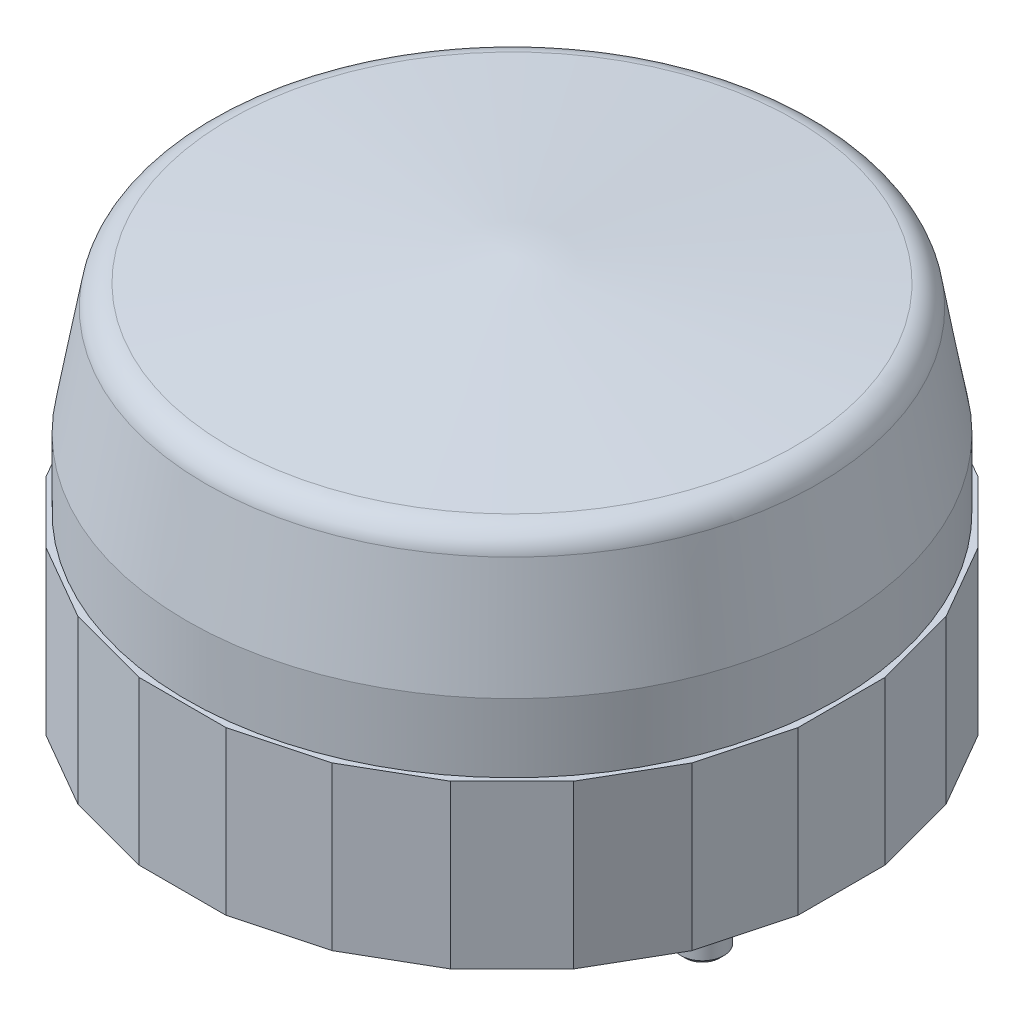
ISO-10303-21;
HEADER;
FILE_DESCRIPTION(('STEP AP214'),'2;1');
FILE_NAME('part.step','',(''),(''),'','','');
FILE_SCHEMA(('AUTOMOTIVE_DESIGN { 1 0 10303 214 1 1 1 1 }'));
ENDSEC;
DATA;
#1=APPLICATION_CONTEXT('core data for automotive mechanical design processes');
#2=APPLICATION_PROTOCOL_DEFINITION('international standard','automotive_design',2000,#1);
#3=PRODUCT_CONTEXT('',#1,'mechanical');
#4=PRODUCT('Part','Part','',(#3));
#5=PRODUCT_RELATED_PRODUCT_CATEGORY('part','',(#4));
#6=PRODUCT_DEFINITION_FORMATION('','',#4);
#7=PRODUCT_DEFINITION_CONTEXT('part definition',#1,'design');
#8=PRODUCT_DEFINITION('design','',#6,#7);
#9=PRODUCT_DEFINITION_SHAPE('','',#8);
#10=(LENGTH_UNIT() NAMED_UNIT(*) SI_UNIT(.MILLI.,.METRE.));
#11=(NAMED_UNIT(*) PLANE_ANGLE_UNIT() SI_UNIT($,.RADIAN.));
#12=(NAMED_UNIT(*) SI_UNIT($,.STERADIAN.) SOLID_ANGLE_UNIT());
#13=UNCERTAINTY_MEASURE_WITH_UNIT(LENGTH_MEASURE(1.E-05),#10,'distance_accuracy_value','');
#14=(GEOMETRIC_REPRESENTATION_CONTEXT(3) GLOBAL_UNCERTAINTY_ASSIGNED_CONTEXT((#13)) GLOBAL_UNIT_ASSIGNED_CONTEXT((#10,
#11,#12)) REPRESENTATION_CONTEXT('',''));
#15=CARTESIAN_POINT('',(0.,0.,0.));
#16=DIRECTION('',(0.,0.,1.));
#17=DIRECTION('',(1.,0.,0.));
#18=AXIS2_PLACEMENT_3D('',#15,#16,#17);
#19=CARTESIAN_POINT('',(22.25,-13.75,0.));
#20=DIRECTION('',(0.,1.,0.));
#21=DIRECTION('',(-1.,0.,0.));
#22=AXIS2_PLACEMENT_3D('',#19,#20,#21);
#23=CONICAL_SURFACE('',#22,2.25,0.785398162499998);
#24=CARTESIAN_POINT('',(22.25,-13.5,0.));
#25=DIRECTION('',(0.,-1.,0.));
#26=DIRECTION('',(-1.,0.,0.));
#27=AXIS2_PLACEMENT_3D('',#24,#25,#26);
#28=CIRCLE('',#27,2.5);
#29=CARTESIAN_POINT('',(24.75,-13.5,0.));
#30=VERTEX_POINT('',#29);
#31=EDGE_CURVE('E11',#30,#30,#28,.T.);
#32=ORIENTED_EDGE('',*,*,#31,.T.);
#33=EDGE_LOOP('',(#32));
#34=FACE_BOUND('',#33,.T.);
#35=CARTESIAN_POINT('',(22.25,-14.,0.));
#36=DIRECTION('',(0.,1.,0.));
#37=DIRECTION('',(-1.,0.,0.));
#38=AXIS2_PLACEMENT_3D('',#35,#36,#37);
#39=CIRCLE('',#38,2.);
#40=CARTESIAN_POINT('',(24.25,-14.,0.));
#41=VERTEX_POINT('',#40);
#42=EDGE_CURVE('E26',#41,#41,#39,.T.);
#43=ORIENTED_EDGE('',*,*,#42,.T.);
#44=EDGE_LOOP('',(#43));
#45=FACE_BOUND('',#44,.T.);
#46=ADVANCED_FACE('F16',(#34,#45),#23,.T.);
#47=CARTESIAN_POINT('',(22.25,0.,0.));
#48=DIRECTION('',(0.,-1.,0.));
#49=DIRECTION('',(-1.,0.,0.));
#50=AXIS2_PLACEMENT_3D('',#47,#48,#49);
#51=CYLINDRICAL_SURFACE('',#50,2.5);
#52=CARTESIAN_POINT('',(22.25,0.,0.));
#53=DIRECTION('',(0.,1.,0.));
#54=DIRECTION('',(-1.,0.,0.));
#55=AXIS2_PLACEMENT_3D('',#52,#53,#54);
#56=CIRCLE('',#55,2.5);
#57=CARTESIAN_POINT('',(24.75,0.,0.));
#58=VERTEX_POINT('',#57);
#59=EDGE_CURVE('E558',#58,#58,#56,.T.);
#60=ORIENTED_EDGE('',*,*,#59,.F.);
#61=EDGE_LOOP('',(#60));
#62=FACE_BOUND('',#61,.T.);
#63=ORIENTED_EDGE('',*,*,#31,.F.);
#64=EDGE_LOOP('',(#63));
#65=FACE_BOUND('',#64,.T.);
#66=ADVANCED_FACE('F802',(#62,#65),#51,.T.);
#67=CARTESIAN_POINT('',(22.25,-14.,0.));
#68=DIRECTION('',(0.,1.,0.));
#69=DIRECTION('',(1.,0.,0.));
#70=AXIS2_PLACEMENT_3D('',#67,#68,#69);
#71=PLANE('',#70);
#72=ORIENTED_EDGE('',*,*,#42,.F.);
#73=EDGE_LOOP('',(#72));
#74=FACE_BOUND('',#73,.T.);
#75=ADVANCED_FACE('F808',(#74),#71,.F.);
#76=CARTESIAN_POINT('',(-22.25,-13.75,0.));
#77=DIRECTION('',(0.,1.,0.));
#78=DIRECTION('',(-1.,0.,0.));
#79=AXIS2_PLACEMENT_3D('',#76,#77,#78);
#80=CONICAL_SURFACE('',#79,2.25,0.785398162499998);
#81=CARTESIAN_POINT('',(-22.25,-13.5,0.));
#82=DIRECTION('',(0.,-1.,0.));
#83=DIRECTION('',(-1.,0.,0.));
#84=AXIS2_PLACEMENT_3D('',#81,#82,#83);
#85=CIRCLE('',#84,2.5);
#86=CARTESIAN_POINT('',(-19.75,-13.5,0.));
#87=VERTEX_POINT('',#86);
#88=EDGE_CURVE('E317',#87,#87,#85,.T.);
#89=ORIENTED_EDGE('',*,*,#88,.T.);
#90=EDGE_LOOP('',(#89));
#91=FACE_BOUND('',#90,.T.);
#92=CARTESIAN_POINT('',(-22.25,-14.,0.));
#93=DIRECTION('',(0.,1.,0.));
#94=DIRECTION('',(-1.,0.,0.));
#95=AXIS2_PLACEMENT_3D('',#92,#93,#94);
#96=CIRCLE('',#95,2.);
#97=CARTESIAN_POINT('',(-20.25,-14.,0.));
#98=VERTEX_POINT('',#97);
#99=EDGE_CURVE('E426',#98,#98,#96,.T.);
#100=ORIENTED_EDGE('',*,*,#99,.T.);
#101=EDGE_LOOP('',(#100));
#102=FACE_BOUND('',#101,.T.);
#103=ADVANCED_FACE('F930',(#91,#102),#80,.T.);
#104=CARTESIAN_POINT('',(-22.25,0.,0.));
#105=DIRECTION('',(0.,-1.,0.));
#106=DIRECTION('',(-1.,0.,0.));
#107=AXIS2_PLACEMENT_3D('',#104,#105,#106);
#108=CYLINDRICAL_SURFACE('',#107,2.5);
#109=CARTESIAN_POINT('',(-22.25,0.,0.));
#110=DIRECTION('',(0.,1.,0.));
#111=DIRECTION('',(-1.,0.,0.));
#112=AXIS2_PLACEMENT_3D('',#109,#110,#111);
#113=CIRCLE('',#112,2.5);
#114=CARTESIAN_POINT('',(-19.75,0.,0.));
#115=VERTEX_POINT('',#114);
#116=EDGE_CURVE('E436',#115,#115,#113,.T.);
#117=ORIENTED_EDGE('',*,*,#116,.F.);
#118=EDGE_LOOP('',(#117));
#119=FACE_BOUND('',#118,.T.);
#120=ORIENTED_EDGE('',*,*,#88,.F.);
#121=EDGE_LOOP('',(#120));
#122=FACE_BOUND('',#121,.T.);
#123=ADVANCED_FACE('F813',(#119,#122),#108,.T.);
#124=CARTESIAN_POINT('',(-22.25,-14.,0.));
#125=DIRECTION('',(0.,1.,0.));
#126=DIRECTION('',(1.,0.,0.));
#127=AXIS2_PLACEMENT_3D('',#124,#125,#126);
#128=PLANE('',#127);
#129=ORIENTED_EDGE('',*,*,#99,.F.);
#130=EDGE_LOOP('',(#129));
#131=FACE_BOUND('',#130,.T.);
#132=ADVANCED_FACE('F913',(#131),#128,.F.);
#133=CARTESIAN_POINT('',(0.,33.3634229025263,0.));
#134=DIRECTION('',(0.,-1.,0.));
#135=DIRECTION('',(0.,0.,1.));
#136=AXIS2_PLACEMENT_3D('',#133,#134,#135);
#137=CONICAL_SURFACE('',#136,36.8779568526265,0.174532925);
#138=CARTESIAN_POINT('',(0.,39.7268458050524,0.));
#139=DIRECTION('',(0.,1.,0.));
#140=DIRECTION('',(0.,0.,1.));
#141=AXIS2_PLACEMENT_3D('',#138,#139,#140);
#142=CIRCLE('',#141,35.7559137052529);
#143=CARTESIAN_POINT('',(0.,39.7268458050524,35.7559137052529));
#144=VERTEX_POINT('',#143);
#145=EDGE_CURVE('E416',#144,#144,#142,.T.);
#146=ORIENTED_EDGE('',*,*,#145,.F.);
#147=EDGE_LOOP('',(#146));
#148=FACE_BOUND('',#147,.T.);
#149=CARTESIAN_POINT('',(0.,27.,0.));
#150=DIRECTION('',(0.,1.,0.));
#151=DIRECTION('',(-1.,0.,0.));
#152=AXIS2_PLACEMENT_3D('',#149,#150,#151);
#153=CIRCLE('',#152,38.);
#154=CARTESIAN_POINT('',(38.,27.,0.));
#155=VERTEX_POINT('',#154);
#156=EDGE_CURVE('E419',#155,#155,#153,.T.);
#157=ORIENTED_EDGE('',*,*,#156,.T.);
#158=EDGE_LOOP('',(#157));
#159=FACE_BOUND('',#158,.T.);
#160=ADVANCED_FACE('F905',(#148,#159),#137,.T.);
#161=CARTESIAN_POINT('',(0.,39.2059012720516,0.));
#162=DIRECTION('',(0.,1.,0.));
#163=DIRECTION('',(0.,0.,1.));
#164=AXIS2_PLACEMENT_3D('',#161,#162,#163);
#165=TOROIDAL_SURFACE('',#164,32.8014904462163,3.);
#166=CARTESIAN_POINT('',(0.,42.1951590969856,0.));
#167=DIRECTION('',(0.,1.,0.));
#168=DIRECTION('',(0.,0.,1.));
#169=AXIS2_PLACEMENT_3D('',#166,#167,#168);
#170=CIRCLE('',#169,33.0551391325344);
#171=CARTESIAN_POINT('',(0.,42.1951590969856,33.0551391325344));
#172=VERTEX_POINT('',#171);
#173=EDGE_CURVE('E373',#172,#172,#170,.T.);
#174=ORIENTED_EDGE('',*,*,#173,.F.);
#175=EDGE_LOOP('',(#174));
#176=FACE_BOUND('',#175,.T.);
#177=ORIENTED_EDGE('',*,*,#145,.T.);
#178=EDGE_LOOP('',(#177));
#179=FACE_BOUND('',#178,.T.);
#180=ADVANCED_FACE('F902',(#176,#179),#165,.T.);
#181=CARTESIAN_POINT('',(0.,43.5975795484928,0.));
#182=DIRECTION('',(0.,-1.,0.));
#183=DIRECTION('',(0.,0.,1.));
#184=AXIS2_PLACEMENT_3D('',#181,#182,#183);
#185=CONICAL_SURFACE('',#184,16.5275695662672,1.48614570198298);
#186=CARTESIAN_POINT('',(0.,45.0000000282687,0.));
#187=VERTEX_POINT('',#186);
#188=VERTEX_LOOP('',#187);
#189=FACE_BOUND('',#188,.T.);
#190=ORIENTED_EDGE('',*,*,#173,.T.);
#191=EDGE_LOOP('',(#190));
#192=FACE_BOUND('',#191,.T.);
#193=ADVANCED_FACE('F904',(#189,#192),#185,.T.);
#194=CARTESIAN_POINT('',(0.,19.,0.));
#195=DIRECTION('',(0.,1.,0.));
#196=DIRECTION('',(-1.,0.,0.));
#197=AXIS2_PLACEMENT_3D('',#194,#195,#196);
#198=CYLINDRICAL_SURFACE('',#197,38.);
#199=ORIENTED_EDGE('',*,*,#156,.F.);
#200=EDGE_LOOP('',(#199));
#201=FACE_BOUND('',#200,.T.);
#202=CARTESIAN_POINT('',(0.,19.,0.));
#203=DIRECTION('',(0.,-1.,0.));
#204=DIRECTION('',(-1.,0.,0.));
#205=AXIS2_PLACEMENT_3D('',#202,#203,#204);
#206=CIRCLE('',#205,38.);
#207=CARTESIAN_POINT('',(38.,19.,0.));
#208=VERTEX_POINT('',#207);
#209=EDGE_CURVE('E735',#208,#208,#206,.T.);
#210=ORIENTED_EDGE('',*,*,#209,.F.);
#211=EDGE_LOOP('',(#210));
#212=FACE_BOUND('',#211,.T.);
#213=ADVANCED_FACE('F911',(#201,#212),#198,.T.);
#214=CARTESIAN_POINT('',(-23.6395546842207,0.,-30.8076674671435));
#215=DIRECTION('',(-0.707106781186547,0.,-0.707106781186548));
#216=DIRECTION('',(-0.707106781186548,0.,0.707106781186547));
#217=AXIS2_PLACEMENT_3D('',#214,#215,#216);
#218=PLANE('',#217);
#219=DIRECTION('',(0.707106781186548,0.,-0.707106781186547));
#220=VECTOR('',#219,1.);
#221=CARTESIAN_POINT('',(-30.8076674671435,0.,-23.6395546842207));
#222=LINE('',#221,#220);
#223=CARTESIAN_POINT('',(-30.8076674671435,0.,-23.6395546842207));
#224=VERTEX_POINT('',#223);
#225=CARTESIAN_POINT('',(-23.6395546842207,0.,-30.8076674671435));
#226=VERTEX_POINT('',#225);
#227=EDGE_CURVE('E571',#224,#226,#222,.T.);
#228=ORIENTED_EDGE('',*,*,#227,.F.);
#229=DIRECTION('',(0.,1.,0.));
#230=VECTOR('',#229,1.);
#231=CARTESIAN_POINT('',(-30.8076674671435,0.,-23.6395546842207));
#232=LINE('',#231,#230);
#233=CARTESIAN_POINT('',(-30.8076674671435,19.,-23.6395546842207));
#234=VERTEX_POINT('',#233);
#235=EDGE_CURVE('E369',#224,#234,#232,.T.);
#236=ORIENTED_EDGE('',*,*,#235,.T.);
#237=DIRECTION('',(-0.707106781186548,0.,0.707106781186547));
#238=VECTOR('',#237,1.);
#239=CARTESIAN_POINT('',(-23.6395546842207,19.,-30.8076674671435));
#240=LINE('',#239,#238);
#241=CARTESIAN_POINT('',(-23.6395546842207,19.,-30.8076674671435));
#242=VERTEX_POINT('',#241);
#243=EDGE_CURVE('E413',#242,#234,#240,.T.);
#244=ORIENTED_EDGE('',*,*,#243,.F.);
#245=DIRECTION('',(0.,1.,0.));
#246=VECTOR('',#245,1.);
#247=CARTESIAN_POINT('',(-23.6395546842207,0.,-30.8076674671435));
#248=LINE('',#247,#246);
#249=EDGE_CURVE('E374',#226,#242,#248,.T.);
#250=ORIENTED_EDGE('',*,*,#249,.F.);
#251=EDGE_LOOP('',(#228,#236,#244,#250));
#252=FACE_BOUND('',#251,.T.);
#253=ADVANCED_FACE('F824',(#252),#218,.T.);
#254=CARTESIAN_POINT('',(-14.8604453157794,0.,-35.8762886242583));
#255=DIRECTION('',(-0.5,0.,-0.866025403784439));
#256=DIRECTION('',(-0.866025403784439,0.,0.5));
#257=AXIS2_PLACEMENT_3D('',#254,#255,#256);
#258=PLANE('',#257);
#259=DIRECTION('',(0.866025403784439,0.,-0.5));
#260=VECTOR('',#259,1.);
#261=CARTESIAN_POINT('',(-23.6395546842207,0.,-30.8076674671435));
#262=LINE('',#261,#260);
#263=CARTESIAN_POINT('',(-14.8604453157794,0.,-35.8762886242583));
#264=VERTEX_POINT('',#263);
#265=EDGE_CURVE('E576',#226,#264,#262,.T.);
#266=ORIENTED_EDGE('',*,*,#265,.F.);
#267=ORIENTED_EDGE('',*,*,#249,.T.);
#268=DIRECTION('',(-0.866025403784439,0.,0.5));
#269=VECTOR('',#268,1.);
#270=CARTESIAN_POINT('',(-14.8604453157794,19.,-35.8762886242583));
#271=LINE('',#270,#269);
#272=CARTESIAN_POINT('',(-14.8604453157794,19.,-35.8762886242583));
#273=VERTEX_POINT('',#272);
#274=EDGE_CURVE('E408',#273,#242,#271,.T.);
#275=ORIENTED_EDGE('',*,*,#274,.F.);
#276=DIRECTION('',(0.,1.,0.));
#277=VECTOR('',#276,1.);
#278=CARTESIAN_POINT('',(-14.8604453157794,0.,-35.8762886242583));
#279=LINE('',#278,#277);
#280=EDGE_CURVE('E710',#264,#273,#279,.T.);
#281=ORIENTED_EDGE('',*,*,#280,.F.);
#282=EDGE_LOOP('',(#266,#267,#275,#281));
#283=FACE_BOUND('',#282,.T.);
#284=ADVANCED_FACE('F817',(#283),#258,.T.);
#285=CARTESIAN_POINT('',(-5.06862115711474,0.,-38.5));
#286=DIRECTION('',(-0.258819045102519,0.,-0.965925826289069));
#287=DIRECTION('',(-0.965925826289069,0.,0.258819045102519));
#288=AXIS2_PLACEMENT_3D('',#285,#286,#287);
#289=PLANE('',#288);
#290=DIRECTION('',(0.965925826289069,0.,-0.258819045102519));
#291=VECTOR('',#290,1.);
#292=CARTESIAN_POINT('',(-14.8604453157794,0.,-35.8762886242583));
#293=LINE('',#292,#291);
#294=CARTESIAN_POINT('',(-5.06862115711473,0.,-38.5));
#295=VERTEX_POINT('',#294);
#296=EDGE_CURVE('E281',#264,#295,#293,.T.);
#297=ORIENTED_EDGE('',*,*,#296,.F.);
#298=ORIENTED_EDGE('',*,*,#280,.T.);
#299=DIRECTION('',(-0.965925826289069,0.,0.258819045102519));
#300=VECTOR('',#299,1.);
#301=CARTESIAN_POINT('',(-5.06862115711474,19.,-38.5));
#302=LINE('',#301,#300);
#303=CARTESIAN_POINT('',(-5.06862115711474,19.,-38.5));
#304=VERTEX_POINT('',#303);
#305=EDGE_CURVE('E412',#304,#273,#302,.T.);
#306=ORIENTED_EDGE('',*,*,#305,.F.);
#307=DIRECTION('',(0.,1.,0.));
#308=VECTOR('',#307,1.);
#309=CARTESIAN_POINT('',(-5.06862115711473,0.,-38.5));
#310=LINE('',#309,#308);
#311=EDGE_CURVE('E295',#295,#304,#310,.T.);
#312=ORIENTED_EDGE('',*,*,#311,.F.);
#313=EDGE_LOOP('',(#297,#298,#306,#312));
#314=FACE_BOUND('',#313,.T.);
#315=ADVANCED_FACE('F815',(#314),#289,.T.);
#316=CARTESIAN_POINT('',(5.06862115711475,0.,-38.5));
#317=DIRECTION('',(0.,0.,-1.));
#318=DIRECTION('',(0.,-1.,0.));
#319=AXIS2_PLACEMENT_3D('',#316,#317,#318);
#320=PLANE('',#319);
#321=DIRECTION('',(1.,0.,0.));
#322=VECTOR('',#321,1.);
#323=CARTESIAN_POINT('',(-5.06862115711473,0.,-38.5));
#324=LINE('',#323,#322);
#325=CARTESIAN_POINT('',(5.06862115711475,0.,-38.5));
#326=VERTEX_POINT('',#325);
#327=EDGE_CURVE('E272',#295,#326,#324,.T.);
#328=ORIENTED_EDGE('',*,*,#327,.F.);
#329=ORIENTED_EDGE('',*,*,#311,.T.);
#330=DIRECTION('',(-1.,0.,0.));
#331=VECTOR('',#330,1.);
#332=CARTESIAN_POINT('',(5.06862115711475,19.,-38.5));
#333=LINE('',#332,#331);
#334=CARTESIAN_POINT('',(5.06862115711475,19.,-38.5));
#335=VERTEX_POINT('',#334);
#336=EDGE_CURVE('E291',#335,#304,#333,.T.);
#337=ORIENTED_EDGE('',*,*,#336,.F.);
#338=DIRECTION('',(0.,1.,0.));
#339=VECTOR('',#338,1.);
#340=CARTESIAN_POINT('',(5.06862115711475,0.,-38.5));
#341=LINE('',#340,#339);
#342=EDGE_CURVE('E288',#326,#335,#341,.T.);
#343=ORIENTED_EDGE('',*,*,#342,.F.);
#344=EDGE_LOOP('',(#328,#329,#337,#343));
#345=FACE_BOUND('',#344,.T.);
#346=ADVANCED_FACE('F289',(#345),#320,.T.);
#347=CARTESIAN_POINT('',(14.8604453157794,0.,-35.8762886242583));
#348=DIRECTION('',(0.258819045102521,0.,-0.965925826289068));
#349=DIRECTION('',(0.,-1.,0.));
#350=AXIS2_PLACEMENT_3D('',#347,#348,#349);
#351=PLANE('',#350);
#352=DIRECTION('',(0.965925826289068,0.,0.258819045102521));
#353=VECTOR('',#352,1.);
#354=CARTESIAN_POINT('',(5.06862115711475,0.,-38.5));
#355=LINE('',#354,#353);
#356=CARTESIAN_POINT('',(14.8604453157794,0.,-35.8762886242583));
#357=VERTEX_POINT('',#356);
#358=EDGE_CURVE('E278',#326,#357,#355,.T.);
#359=ORIENTED_EDGE('',*,*,#358,.F.);
#360=ORIENTED_EDGE('',*,*,#342,.T.);
#361=DIRECTION('',(-0.965925826289068,0.,-0.258819045102521));
#362=VECTOR('',#361,1.);
#363=CARTESIAN_POINT('',(14.8604453157794,19.,-35.8762886242583));
#364=LINE('',#363,#362);
#365=CARTESIAN_POINT('',(14.8604453157794,19.,-35.8762886242583));
#366=VERTEX_POINT('',#365);
#367=EDGE_CURVE('E415',#366,#335,#364,.T.);
#368=ORIENTED_EDGE('',*,*,#367,.F.);
#369=DIRECTION('',(0.,1.,0.));
#370=VECTOR('',#369,1.);
#371=CARTESIAN_POINT('',(14.8604453157794,0.,-35.8762886242583));
#372=LINE('',#371,#370);
#373=EDGE_CURVE('E296',#357,#366,#372,.T.);
#374=ORIENTED_EDGE('',*,*,#373,.F.);
#375=EDGE_LOOP('',(#359,#360,#368,#374));
#376=FACE_BOUND('',#375,.T.);
#377=ADVANCED_FACE('F298',(#376),#351,.T.);
#378=CARTESIAN_POINT('',(23.6395546842207,0.,-30.8076674671435));
#379=DIRECTION('',(0.5,0.,-0.866025403784439));
#380=DIRECTION('',(0.,-1.,0.));
#381=AXIS2_PLACEMENT_3D('',#378,#379,#380);
#382=PLANE('',#381);
#383=DIRECTION('',(0.866025403784439,0.,0.5));
#384=VECTOR('',#383,1.);
#385=CARTESIAN_POINT('',(14.8604453157794,0.,-35.8762886242583));
#386=LINE('',#385,#384);
#387=CARTESIAN_POINT('',(23.6395546842207,0.,-30.8076674671435));
#388=VERTEX_POINT('',#387);
#389=EDGE_CURVE('E302',#357,#388,#386,.T.);
#390=ORIENTED_EDGE('',*,*,#389,.F.);
#391=ORIENTED_EDGE('',*,*,#373,.T.);
#392=DIRECTION('',(-0.866025403784439,0.,-0.5));
#393=VECTOR('',#392,1.);
#394=CARTESIAN_POINT('',(23.6395546842207,19.,-30.8076674671435));
#395=LINE('',#394,#393);
#396=CARTESIAN_POINT('',(23.6395546842207,19.,-30.8076674671435));
#397=VERTEX_POINT('',#396);
#398=EDGE_CURVE('E460',#397,#366,#395,.T.);
#399=ORIENTED_EDGE('',*,*,#398,.F.);
#400=DIRECTION('',(0.,1.,0.));
#401=VECTOR('',#400,1.);
#402=CARTESIAN_POINT('',(23.6395546842207,0.,-30.8076674671435));
#403=LINE('',#402,#401);
#404=EDGE_CURVE('E358',#388,#397,#403,.T.);
#405=ORIENTED_EDGE('',*,*,#404,.F.);
#406=EDGE_LOOP('',(#390,#391,#399,#405));
#407=FACE_BOUND('',#406,.T.);
#408=ADVANCED_FACE('F789',(#407),#382,.T.);
#409=CARTESIAN_POINT('',(30.8076674671435,0.,-23.6395546842207));
#410=DIRECTION('',(0.707106781186548,0.,-0.707106781186547));
#411=DIRECTION('',(0.,-1.,0.));
#412=AXIS2_PLACEMENT_3D('',#409,#410,#411);
#413=PLANE('',#412);
#414=DIRECTION('',(0.707106781186547,0.,0.707106781186548));
#415=VECTOR('',#414,1.);
#416=CARTESIAN_POINT('',(23.6395546842207,0.,-30.8076674671435));
#417=LINE('',#416,#415);
#418=CARTESIAN_POINT('',(30.8076674671435,0.,-23.6395546842207));
#419=VERTEX_POINT('',#418);
#420=EDGE_CURVE('E308',#388,#419,#417,.T.);
#421=ORIENTED_EDGE('',*,*,#420,.F.);
#422=ORIENTED_EDGE('',*,*,#404,.T.);
#423=DIRECTION('',(-0.707106781186547,0.,-0.707106781186548));
#424=VECTOR('',#423,1.);
#425=CARTESIAN_POINT('',(30.8076674671435,19.,-23.6395546842207));
#426=LINE('',#425,#424);
#427=CARTESIAN_POINT('',(30.8076674671435,19.,-23.6395546842207));
#428=VERTEX_POINT('',#427);
#429=EDGE_CURVE('E466',#428,#397,#426,.T.);
#430=ORIENTED_EDGE('',*,*,#429,.F.);
#431=DIRECTION('',(0.,1.,0.));
#432=VECTOR('',#431,1.);
#433=CARTESIAN_POINT('',(30.8076674671435,0.,-23.6395546842207));
#434=LINE('',#433,#432);
#435=EDGE_CURVE('E354',#419,#428,#434,.T.);
#436=ORIENTED_EDGE('',*,*,#435,.F.);
#437=EDGE_LOOP('',(#421,#422,#430,#436));
#438=FACE_BOUND('',#437,.T.);
#439=ADVANCED_FACE('F774',(#438),#413,.T.);
#440=CARTESIAN_POINT('',(35.8762886242583,0.,-14.8604453157793));
#441=DIRECTION('',(0.866025403784439,0.,-0.5));
#442=DIRECTION('',(0.,-1.,0.));
#443=AXIS2_PLACEMENT_3D('',#440,#441,#442);
#444=PLANE('',#443);
#445=DIRECTION('',(0.5,0.,0.866025403784439));
#446=VECTOR('',#445,1.);
#447=CARTESIAN_POINT('',(30.8076674671435,0.,-23.6395546842207));
#448=LINE('',#447,#446);
#449=CARTESIAN_POINT('',(35.8762886242583,0.,-14.8604453157793));
#450=VERTEX_POINT('',#449);
#451=EDGE_CURVE('E395',#419,#450,#448,.T.);
#452=ORIENTED_EDGE('',*,*,#451,.F.);
#453=ORIENTED_EDGE('',*,*,#435,.T.);
#454=DIRECTION('',(-0.5,0.,-0.866025403784439));
#455=VECTOR('',#454,1.);
#456=CARTESIAN_POINT('',(35.8762886242583,19.,-14.8604453157794));
#457=LINE('',#456,#455);
#458=CARTESIAN_POINT('',(35.8762886242583,19.,-14.8604453157793));
#459=VERTEX_POINT('',#458);
#460=EDGE_CURVE('E312',#459,#428,#457,.T.);
#461=ORIENTED_EDGE('',*,*,#460,.F.);
#462=DIRECTION('',(0.,1.,0.));
#463=VECTOR('',#462,1.);
#464=CARTESIAN_POINT('',(35.8762886242583,0.,-14.8604453157793));
#465=LINE('',#464,#463);
#466=EDGE_CURVE('E359',#450,#459,#465,.T.);
#467=ORIENTED_EDGE('',*,*,#466,.F.);
#468=EDGE_LOOP('',(#452,#453,#461,#467));
#469=FACE_BOUND('',#468,.T.);
#470=ADVANCED_FACE('F782',(#469),#444,.T.);
#471=CARTESIAN_POINT('',(38.5,0.,-5.06862115711473));
#472=DIRECTION('',(0.965925826289068,0.,-0.258819045102521));
#473=DIRECTION('',(0.,-1.,0.));
#474=AXIS2_PLACEMENT_3D('',#471,#472,#473);
#475=PLANE('',#474);
#476=DIRECTION('',(0.258819045102521,0.,0.965925826289068));
#477=VECTOR('',#476,1.);
#478=CARTESIAN_POINT('',(35.8762886242583,0.,-14.8604453157793));
#479=LINE('',#478,#477);
#480=CARTESIAN_POINT('',(38.5,0.,-5.06862115711473));
#481=VERTEX_POINT('',#480);
#482=EDGE_CURVE('E363',#450,#481,#479,.T.);
#483=ORIENTED_EDGE('',*,*,#482,.F.);
#484=ORIENTED_EDGE('',*,*,#466,.T.);
#485=DIRECTION('',(-0.258819045102521,0.,-0.965925826289068));
#486=VECTOR('',#485,1.);
#487=CARTESIAN_POINT('',(38.5,19.,-5.06862115711473));
#488=LINE('',#487,#486);
#489=CARTESIAN_POINT('',(38.5,19.,-5.06862115711473));
#490=VERTEX_POINT('',#489);
#491=EDGE_CURVE('E344',#490,#459,#488,.T.);
#492=ORIENTED_EDGE('',*,*,#491,.F.);
#493=DIRECTION('',(0.,1.,0.));
#494=VECTOR('',#493,1.);
#495=CARTESIAN_POINT('',(38.5,0.,-5.06862115711473));
#496=LINE('',#495,#494);
#497=EDGE_CURVE('E441',#481,#490,#496,.T.);
#498=ORIENTED_EDGE('',*,*,#497,.F.);
#499=EDGE_LOOP('',(#483,#484,#492,#498));
#500=FACE_BOUND('',#499,.T.);
#501=ADVANCED_FACE('F785',(#500),#475,.T.);
#502=CARTESIAN_POINT('',(38.5,0.,5.06862115711475));
#503=DIRECTION('',(1.,0.,0.));
#504=DIRECTION('',(0.,1.,0.));
#505=AXIS2_PLACEMENT_3D('',#502,#503,#504);
#506=PLANE('',#505);
#507=DIRECTION('',(0.,0.,1.));
#508=VECTOR('',#507,1.);
#509=CARTESIAN_POINT('',(38.5,0.,-5.06862115711473));
#510=LINE('',#509,#508);
#511=CARTESIAN_POINT('',(38.5,0.,5.06862115711475));
#512=VERTEX_POINT('',#511);
#513=EDGE_CURVE('E360',#481,#512,#510,.T.);
#514=ORIENTED_EDGE('',*,*,#513,.F.);
#515=ORIENTED_EDGE('',*,*,#497,.T.);
#516=DIRECTION('',(0.,0.,-1.));
#517=VECTOR('',#516,1.);
#518=CARTESIAN_POINT('',(38.5,19.,5.06862115711475));
#519=LINE('',#518,#517);
#520=CARTESIAN_POINT('',(38.5,19.,5.06862115711475));
#521=VERTEX_POINT('',#520);
#522=EDGE_CURVE('E348',#521,#490,#519,.T.);
#523=ORIENTED_EDGE('',*,*,#522,.F.);
#524=DIRECTION('',(0.,1.,0.));
#525=VECTOR('',#524,1.);
#526=CARTESIAN_POINT('',(38.5,0.,5.06862115711475));
#527=LINE('',#526,#525);
#528=EDGE_CURVE('E568',#512,#521,#527,.T.);
#529=ORIENTED_EDGE('',*,*,#528,.F.);
#530=EDGE_LOOP('',(#514,#515,#523,#529));
#531=FACE_BOUND('',#530,.T.);
#532=ADVANCED_FACE('F933',(#531),#506,.T.);
#533=CARTESIAN_POINT('',(35.8762886242583,0.,14.8604453157794));
#534=DIRECTION('',(0.965925826289068,0.,0.258819045102521));
#535=DIRECTION('',(0.,-1.,0.));
#536=AXIS2_PLACEMENT_3D('',#533,#534,#535);
#537=PLANE('',#536);
#538=DIRECTION('',(-0.258819045102521,0.,0.965925826289068));
#539=VECTOR('',#538,1.);
#540=CARTESIAN_POINT('',(38.5,0.,5.06862115711475));
#541=LINE('',#540,#539);
#542=CARTESIAN_POINT('',(35.8762886242583,0.,14.8604453157794));
#543=VERTEX_POINT('',#542);
#544=EDGE_CURVE('E227',#512,#543,#541,.T.);
#545=ORIENTED_EDGE('',*,*,#544,.F.);
#546=ORIENTED_EDGE('',*,*,#528,.T.);
#547=DIRECTION('',(0.258819045102521,0.,-0.965925826289068));
#548=VECTOR('',#547,1.);
#549=CARTESIAN_POINT('',(35.8762886242583,19.,14.8604453157794));
#550=LINE('',#549,#548);
#551=CARTESIAN_POINT('',(35.8762886242583,19.,14.8604453157794));
#552=VERTEX_POINT('',#551);
#553=EDGE_CURVE('E448',#552,#521,#550,.T.);
#554=ORIENTED_EDGE('',*,*,#553,.F.);
#555=DIRECTION('',(0.,1.,0.));
#556=VECTOR('',#555,1.);
#557=CARTESIAN_POINT('',(35.8762886242583,0.,14.8604453157794));
#558=LINE('',#557,#556);
#559=EDGE_CURVE('E402',#543,#552,#558,.T.);
#560=ORIENTED_EDGE('',*,*,#559,.F.);
#561=EDGE_LOOP('',(#545,#546,#554,#560));
#562=FACE_BOUND('',#561,.T.);
#563=ADVANCED_FACE('F923',(#562),#537,.T.);
#564=CARTESIAN_POINT('',(30.8076674671435,0.,23.6395546842207));
#565=DIRECTION('',(0.866025403784439,0.,0.5));
#566=DIRECTION('',(0.,-1.,0.));
#567=AXIS2_PLACEMENT_3D('',#564,#565,#566);
#568=PLANE('',#567);
#569=DIRECTION('',(-0.5,0.,0.866025403784439));
#570=VECTOR('',#569,1.);
#571=CARTESIAN_POINT('',(35.8762886242583,0.,14.8604453157794));
#572=LINE('',#571,#570);
#573=CARTESIAN_POINT('',(30.8076674671435,0.,23.6395546842207));
#574=VERTEX_POINT('',#573);
#575=EDGE_CURVE('E396',#543,#574,#572,.T.);
#576=ORIENTED_EDGE('',*,*,#575,.F.);
#577=ORIENTED_EDGE('',*,*,#559,.T.);
#578=DIRECTION('',(0.5,0.,-0.866025403784439));
#579=VECTOR('',#578,1.);
#580=CARTESIAN_POINT('',(30.8076674671435,19.,23.6395546842207));
#581=LINE('',#580,#579);
#582=CARTESIAN_POINT('',(30.8076674671435,19.,23.6395546842207));
#583=VERTEX_POINT('',#582);
#584=EDGE_CURVE('E239',#583,#552,#581,.T.);
#585=ORIENTED_EDGE('',*,*,#584,.F.);
#586=DIRECTION('',(0.,1.,0.));
#587=VECTOR('',#586,1.);
#588=CARTESIAN_POINT('',(30.8076674671435,0.,23.6395546842207));
#589=LINE('',#588,#587);
#590=EDGE_CURVE('E334',#574,#583,#589,.T.);
#591=ORIENTED_EDGE('',*,*,#590,.F.);
#592=EDGE_LOOP('',(#576,#577,#585,#591));
#593=FACE_BOUND('',#592,.T.);
#594=ADVANCED_FACE('F919',(#593),#568,.T.);
#595=CARTESIAN_POINT('',(23.6395546842207,0.,30.8076674671435));
#596=DIRECTION('',(0.707106781186548,0.,0.707106781186548));
#597=DIRECTION('',(0.,-1.,0.));
#598=AXIS2_PLACEMENT_3D('',#595,#596,#597);
#599=PLANE('',#598);
#600=DIRECTION('',(-0.707106781186548,0.,0.707106781186548));
#601=VECTOR('',#600,1.);
#602=CARTESIAN_POINT('',(30.8076674671435,0.,23.6395546842207));
#603=LINE('',#602,#601);
#604=CARTESIAN_POINT('',(23.6395546842207,0.,30.8076674671435));
#605=VERTEX_POINT('',#604);
#606=EDGE_CURVE('E399',#574,#605,#603,.T.);
#607=ORIENTED_EDGE('',*,*,#606,.F.);
#608=ORIENTED_EDGE('',*,*,#590,.T.);
#609=DIRECTION('',(0.707106781186548,0.,-0.707106781186548));
#610=VECTOR('',#609,1.);
#611=CARTESIAN_POINT('',(23.6395546842207,19.,30.8076674671435));
#612=LINE('',#611,#610);
#613=CARTESIAN_POINT('',(23.6395546842207,19.,30.8076674671435));
#614=VERTEX_POINT('',#613);
#615=EDGE_CURVE('E442',#614,#583,#612,.T.);
#616=ORIENTED_EDGE('',*,*,#615,.F.);
#617=DIRECTION('',(0.,1.,0.));
#618=VECTOR('',#617,1.);
#619=CARTESIAN_POINT('',(23.6395546842207,0.,30.8076674671435));
#620=LINE('',#619,#618);
#621=EDGE_CURVE('E330',#605,#614,#620,.T.);
#622=ORIENTED_EDGE('',*,*,#621,.F.);
#623=EDGE_LOOP('',(#607,#608,#616,#622));
#624=FACE_BOUND('',#623,.T.);
#625=ADVANCED_FACE('F922',(#624),#599,.T.);
#626=CARTESIAN_POINT('',(14.8604453157794,0.,35.8762886242583));
#627=DIRECTION('',(0.5,0.,0.866025403784439));
#628=DIRECTION('',(0.,-1.,0.));
#629=AXIS2_PLACEMENT_3D('',#626,#627,#628);
#630=PLANE('',#629);
#631=DIRECTION('',(-0.866025403784439,0.,0.5));
#632=VECTOR('',#631,1.);
#633=CARTESIAN_POINT('',(23.6395546842207,0.,30.8076674671435));
#634=LINE('',#633,#632);
#635=CARTESIAN_POINT('',(14.8604453157794,0.,35.8762886242583));
#636=VERTEX_POINT('',#635);
#637=EDGE_CURVE('E406',#605,#636,#634,.T.);
#638=ORIENTED_EDGE('',*,*,#637,.F.);
#639=ORIENTED_EDGE('',*,*,#621,.T.);
#640=DIRECTION('',(0.866025403784439,0.,-0.5));
#641=VECTOR('',#640,1.);
#642=CARTESIAN_POINT('',(14.8604453157794,19.,35.8762886242583));
#643=LINE('',#642,#641);
#644=CARTESIAN_POINT('',(14.8604453157794,19.,35.8762886242583));
#645=VERTEX_POINT('',#644);
#646=EDGE_CURVE('E387',#645,#614,#643,.T.);
#647=ORIENTED_EDGE('',*,*,#646,.F.);
#648=DIRECTION('',(0.,1.,0.));
#649=VECTOR('',#648,1.);
#650=CARTESIAN_POINT('',(14.8604453157794,0.,35.8762886242583));
#651=LINE('',#650,#649);
#652=EDGE_CURVE('E335',#636,#645,#651,.T.);
#653=ORIENTED_EDGE('',*,*,#652,.F.);
#654=EDGE_LOOP('',(#638,#639,#647,#653));
#655=FACE_BOUND('',#654,.T.);
#656=ADVANCED_FACE('F954',(#655),#630,.T.);
#657=CARTESIAN_POINT('',(5.06862115711474,0.,38.5));
#658=DIRECTION('',(0.258819045102521,0.,0.965925826289068));
#659=DIRECTION('',(0.,-1.,0.));
#660=AXIS2_PLACEMENT_3D('',#657,#658,#659);
#661=PLANE('',#660);
#662=DIRECTION('',(-0.965925826289068,0.,0.258819045102521));
#663=VECTOR('',#662,1.);
#664=CARTESIAN_POINT('',(14.8604453157794,0.,35.8762886242583));
#665=LINE('',#664,#663);
#666=CARTESIAN_POINT('',(5.06862115711474,0.,38.5));
#667=VERTEX_POINT('',#666);
#668=EDGE_CURVE('E403',#636,#667,#665,.T.);
#669=ORIENTED_EDGE('',*,*,#668,.F.);
#670=ORIENTED_EDGE('',*,*,#652,.T.);
#671=DIRECTION('',(0.965925826289068,0.,-0.258819045102521));
#672=VECTOR('',#671,1.);
#673=CARTESIAN_POINT('',(5.06862115711474,19.,38.5));
#674=LINE('',#673,#672);
#675=CARTESIAN_POINT('',(5.06862115711474,19.,38.5));
#676=VERTEX_POINT('',#675);
#677=EDGE_CURVE('E383',#676,#645,#674,.T.);
#678=ORIENTED_EDGE('',*,*,#677,.F.);
#679=DIRECTION('',(0.,1.,0.));
#680=VECTOR('',#679,1.);
#681=CARTESIAN_POINT('',(5.06862115711474,0.,38.5));
#682=LINE('',#681,#680);
#683=EDGE_CURVE('E392',#667,#676,#682,.T.);
#684=ORIENTED_EDGE('',*,*,#683,.F.);
#685=EDGE_LOOP('',(#669,#670,#678,#684));
#686=FACE_BOUND('',#685,.T.);
#687=ADVANCED_FACE('F946',(#686),#661,.T.);
#688=CARTESIAN_POINT('',(-5.06862115711475,0.,38.5));
#689=DIRECTION('',(0.,0.,1.));
#690=DIRECTION('',(1.,0.,0.));
#691=AXIS2_PLACEMENT_3D('',#688,#689,#690);
#692=PLANE('',#691);
#693=DIRECTION('',(-1.,0.,0.));
#694=VECTOR('',#693,1.);
#695=CARTESIAN_POINT('',(5.06862115711474,0.,38.5));
#696=LINE('',#695,#694);
#697=CARTESIAN_POINT('',(-5.06862115711475,0.,38.5));
#698=VERTEX_POINT('',#697);
#699=EDGE_CURVE('E407',#667,#698,#696,.T.);
#700=ORIENTED_EDGE('',*,*,#699,.F.);
#701=ORIENTED_EDGE('',*,*,#683,.T.);
#702=DIRECTION('',(1.,0.,0.));
#703=VECTOR('',#702,1.);
#704=CARTESIAN_POINT('',(-5.06862115711475,19.,38.5));
#705=LINE('',#704,#703);
#706=CARTESIAN_POINT('',(-5.06862115711475,19.,38.5));
#707=VERTEX_POINT('',#706);
#708=EDGE_CURVE('E386',#707,#676,#705,.T.);
#709=ORIENTED_EDGE('',*,*,#708,.F.);
#710=DIRECTION('',(0.,1.,0.));
#711=VECTOR('',#710,1.);
#712=CARTESIAN_POINT('',(-5.06862115711475,0.,38.5));
#713=LINE('',#712,#711);
#714=EDGE_CURVE('E328',#698,#707,#713,.T.);
#715=ORIENTED_EDGE('',*,*,#714,.F.);
#716=EDGE_LOOP('',(#700,#701,#709,#715));
#717=FACE_BOUND('',#716,.T.);
#718=ADVANCED_FACE('F943',(#717),#692,.T.);
#719=CARTESIAN_POINT('',(-14.8604453157794,0.,35.8762886242583));
#720=DIRECTION('',(-0.258819045102521,0.,0.965925826289068));
#721=DIRECTION('',(0.,1.,0.));
#722=AXIS2_PLACEMENT_3D('',#719,#720,#721);
#723=PLANE('',#722);
#724=DIRECTION('',(-0.965925826289068,0.,-0.258819045102521));
#725=VECTOR('',#724,1.);
#726=CARTESIAN_POINT('',(-5.06862115711475,0.,38.5));
#727=LINE('',#726,#725);
#728=CARTESIAN_POINT('',(-14.8604453157794,0.,35.8762886242583));
#729=VERTEX_POINT('',#728);
#730=EDGE_CURVE('E453',#698,#729,#727,.T.);
#731=ORIENTED_EDGE('',*,*,#730,.F.);
#732=ORIENTED_EDGE('',*,*,#714,.T.);
#733=DIRECTION('',(0.965925826289068,0.,0.258819045102521));
#734=VECTOR('',#733,1.);
#735=CARTESIAN_POINT('',(-14.8604453157794,19.,35.8762886242583));
#736=LINE('',#735,#734);
#737=CARTESIAN_POINT('',(-14.8604453157794,19.,35.8762886242583));
#738=VERTEX_POINT('',#737);
#739=EDGE_CURVE('E593',#738,#707,#736,.T.);
#740=ORIENTED_EDGE('',*,*,#739,.F.);
#741=DIRECTION('',(0.,1.,0.));
#742=VECTOR('',#741,1.);
#743=CARTESIAN_POINT('',(-14.8604453157794,0.,35.8762886242583));
#744=LINE('',#743,#742);
#745=EDGE_CURVE('E324',#729,#738,#744,.T.);
#746=ORIENTED_EDGE('',*,*,#745,.F.);
#747=EDGE_LOOP('',(#731,#732,#740,#746));
#748=FACE_BOUND('',#747,.T.);
#749=ADVANCED_FACE('F940',(#748),#723,.T.);
#750=CARTESIAN_POINT('',(-23.6395546842207,0.,30.8076674671435));
#751=DIRECTION('',(-0.5,0.,0.866025403784439));
#752=DIRECTION('',(0.,1.,0.));
#753=AXIS2_PLACEMENT_3D('',#750,#751,#752);
#754=PLANE('',#753);
#755=DIRECTION('',(-0.866025403784439,0.,-0.5));
#756=VECTOR('',#755,1.);
#757=CARTESIAN_POINT('',(-14.8604453157794,0.,35.8762886242583));
#758=LINE('',#757,#756);
#759=CARTESIAN_POINT('',(-23.6395546842207,0.,30.8076674671435));
#760=VERTEX_POINT('',#759);
#761=EDGE_CURVE('E449',#729,#760,#758,.T.);
#762=ORIENTED_EDGE('',*,*,#761,.F.);
#763=ORIENTED_EDGE('',*,*,#745,.T.);
#764=DIRECTION('',(0.866025403784439,0.,0.5));
#765=VECTOR('',#764,1.);
#766=CARTESIAN_POINT('',(-23.6395546842207,19.,30.8076674671435));
#767=LINE('',#766,#765);
#768=CARTESIAN_POINT('',(-23.6395546842207,19.,30.8076674671435));
#769=VERTEX_POINT('',#768);
#770=EDGE_CURVE('E692',#769,#738,#767,.T.);
#771=ORIENTED_EDGE('',*,*,#770,.F.);
#772=DIRECTION('',(0.,1.,0.));
#773=VECTOR('',#772,1.);
#774=CARTESIAN_POINT('',(-23.6395546842207,0.,30.8076674671435));
#775=LINE('',#774,#773);
#776=EDGE_CURVE('E329',#760,#769,#775,.T.);
#777=ORIENTED_EDGE('',*,*,#776,.F.);
#778=EDGE_LOOP('',(#762,#763,#771,#777));
#779=FACE_BOUND('',#778,.T.);
#780=ADVANCED_FACE('F893',(#779),#754,.T.);
#781=CARTESIAN_POINT('',(-30.8076674671435,0.,23.6395546842207));
#782=DIRECTION('',(-0.707106781186547,0.,0.707106781186548));
#783=DIRECTION('',(0.,1.,0.));
#784=AXIS2_PLACEMENT_3D('',#781,#782,#783);
#785=PLANE('',#784);
#786=DIRECTION('',(-0.707106781186548,0.,-0.707106781186547));
#787=VECTOR('',#786,1.);
#788=CARTESIAN_POINT('',(-23.6395546842207,0.,30.8076674671435));
#789=LINE('',#788,#787);
#790=CARTESIAN_POINT('',(-30.8076674671435,0.,23.6395546842207));
#791=VERTEX_POINT('',#790);
#792=EDGE_CURVE('E454',#760,#791,#789,.T.);
#793=ORIENTED_EDGE('',*,*,#792,.F.);
#794=ORIENTED_EDGE('',*,*,#776,.T.);
#795=DIRECTION('',(0.707106781186548,0.,0.707106781186547));
#796=VECTOR('',#795,1.);
#797=CARTESIAN_POINT('',(-30.8076674671435,19.,23.6395546842207));
#798=LINE('',#797,#796);
#799=CARTESIAN_POINT('',(-30.8076674671435,19.,23.6395546842207));
#800=VERTEX_POINT('',#799);
#801=EDGE_CURVE('E685',#800,#769,#798,.T.);
#802=ORIENTED_EDGE('',*,*,#801,.F.);
#803=DIRECTION('',(0.,1.,0.));
#804=VECTOR('',#803,1.);
#805=CARTESIAN_POINT('',(-30.8076674671435,0.,23.6395546842207));
#806=LINE('',#805,#804);
#807=EDGE_CURVE('E20',#791,#800,#806,.T.);
#808=ORIENTED_EDGE('',*,*,#807,.F.);
#809=EDGE_LOOP('',(#793,#794,#802,#808));
#810=FACE_BOUND('',#809,.T.);
#811=ADVANCED_FACE('F886',(#810),#785,.T.);
#812=CARTESIAN_POINT('',(-35.8762886242583,0.,14.8604453157794));
#813=DIRECTION('',(-0.866025403784438,0.,0.5));
#814=DIRECTION('',(0.,1.,0.));
#815=AXIS2_PLACEMENT_3D('',#812,#813,#814);
#816=PLANE('',#815);
#817=DIRECTION('',(-0.5,0.,-0.866025403784438));
#818=VECTOR('',#817,1.);
#819=CARTESIAN_POINT('',(-30.8076674671435,0.,23.6395546842207));
#820=LINE('',#819,#818);
#821=CARTESIAN_POINT('',(-35.8762886242583,0.,14.8604453157794));
#822=VERTEX_POINT('',#821);
#823=EDGE_CURVE('E529',#791,#822,#820,.T.);
#824=ORIENTED_EDGE('',*,*,#823,.F.);
#825=ORIENTED_EDGE('',*,*,#807,.T.);
#826=DIRECTION('',(0.5,0.,0.866025403784438));
#827=VECTOR('',#826,1.);
#828=CARTESIAN_POINT('',(-35.8762886242583,19.,14.8604453157794));
#829=LINE('',#828,#827);
#830=CARTESIAN_POINT('',(-35.8762886242583,19.,14.8604453157794));
#831=VERTEX_POINT('',#830);
#832=EDGE_CURVE('E382',#831,#800,#829,.T.);
#833=ORIENTED_EDGE('',*,*,#832,.F.);
#834=DIRECTION('',(0.,1.,0.));
#835=VECTOR('',#834,1.);
#836=CARTESIAN_POINT('',(-35.8762886242583,0.,14.8604453157794));
#837=LINE('',#836,#835);
#838=EDGE_CURVE('E368',#822,#831,#837,.T.);
#839=ORIENTED_EDGE('',*,*,#838,.F.);
#840=EDGE_LOOP('',(#824,#825,#833,#839));
#841=FACE_BOUND('',#840,.T.);
#842=ADVANCED_FACE('F882',(#841),#816,.T.);
#843=CARTESIAN_POINT('',(-38.5,0.,5.06862115711474));
#844=DIRECTION('',(-0.965925826289068,0.,0.258819045102523));
#845=DIRECTION('',(0.,1.,0.));
#846=AXIS2_PLACEMENT_3D('',#843,#844,#845);
#847=PLANE('',#846);
#848=DIRECTION('',(-0.258819045102523,0.,-0.965925826289068));
#849=VECTOR('',#848,1.);
#850=CARTESIAN_POINT('',(-35.8762886242583,0.,14.8604453157794));
#851=LINE('',#850,#849);
#852=CARTESIAN_POINT('',(-38.5,0.,5.06862115711474));
#853=VERTEX_POINT('',#852);
#854=EDGE_CURVE('E342',#822,#853,#851,.T.);
#855=ORIENTED_EDGE('',*,*,#854,.F.);
#856=ORIENTED_EDGE('',*,*,#838,.T.);
#857=DIRECTION('',(0.258819045102523,0.,0.965925826289068));
#858=VECTOR('',#857,1.);
#859=CARTESIAN_POINT('',(-38.5,19.,5.06862115711474));
#860=LINE('',#859,#858);
#861=CARTESIAN_POINT('',(-38.5,19.,5.06862115711474));
#862=VERTEX_POINT('',#861);
#863=EDGE_CURVE('E378',#862,#831,#860,.T.);
#864=ORIENTED_EDGE('',*,*,#863,.F.);
#865=DIRECTION('',(0.,1.,0.));
#866=VECTOR('',#865,1.);
#867=CARTESIAN_POINT('',(-38.5,0.,5.06862115711474));
#868=LINE('',#867,#866);
#869=EDGE_CURVE('E364',#853,#862,#868,.T.);
#870=ORIENTED_EDGE('',*,*,#869,.F.);
#871=EDGE_LOOP('',(#855,#856,#864,#870));
#872=FACE_BOUND('',#871,.T.);
#873=ADVANCED_FACE('F878',(#872),#847,.T.);
#874=CARTESIAN_POINT('',(-38.5,0.,-5.06862115711475));
#875=DIRECTION('',(-1.,0.,0.));
#876=DIRECTION('',(0.,0.,1.));
#877=AXIS2_PLACEMENT_3D('',#874,#875,#876);
#878=PLANE('',#877);
#879=DIRECTION('',(0.,0.,-1.));
#880=VECTOR('',#879,1.);
#881=CARTESIAN_POINT('',(-38.5,0.,5.06862115711474));
#882=LINE('',#881,#880);
#883=CARTESIAN_POINT('',(-38.5,0.,-5.06862115711475));
#884=VERTEX_POINT('',#883);
#885=EDGE_CURVE('E339',#853,#884,#882,.T.);
#886=ORIENTED_EDGE('',*,*,#885,.F.);
#887=ORIENTED_EDGE('',*,*,#869,.T.);
#888=DIRECTION('',(0.,0.,1.));
#889=VECTOR('',#888,1.);
#890=CARTESIAN_POINT('',(-38.5,19.,-5.06862115711475));
#891=LINE('',#890,#889);
#892=CARTESIAN_POINT('',(-38.5,19.,-5.06862115711475));
#893=VERTEX_POINT('',#892);
#894=EDGE_CURVE('E353',#893,#862,#891,.T.);
#895=ORIENTED_EDGE('',*,*,#894,.F.);
#896=DIRECTION('',(0.,1.,0.));
#897=VECTOR('',#896,1.);
#898=CARTESIAN_POINT('',(-38.5,0.,-5.06862115711475));
#899=LINE('',#898,#897);
#900=EDGE_CURVE('E322',#884,#893,#899,.T.);
#901=ORIENTED_EDGE('',*,*,#900,.F.);
#902=EDGE_LOOP('',(#886,#887,#895,#901));
#903=FACE_BOUND('',#902,.T.);
#904=ADVANCED_FACE('F874',(#903),#878,.T.);
#905=CARTESIAN_POINT('',(-35.8762886242583,0.,-14.8604453157794));
#906=DIRECTION('',(-0.965925826289068,0.,-0.258819045102521));
#907=DIRECTION('',(-0.258819045102521,0.,0.965925826289068));
#908=AXIS2_PLACEMENT_3D('',#905,#906,#907);
#909=PLANE('',#908);
#910=DIRECTION('',(0.258819045102521,0.,-0.965925826289068));
#911=VECTOR('',#910,1.);
#912=CARTESIAN_POINT('',(-38.5,0.,-5.06862115711475));
#913=LINE('',#912,#911);
#914=CARTESIAN_POINT('',(-35.8762886242583,0.,-14.8604453157794));
#915=VERTEX_POINT('',#914);
#916=EDGE_CURVE('E343',#884,#915,#913,.T.);
#917=ORIENTED_EDGE('',*,*,#916,.F.);
#918=ORIENTED_EDGE('',*,*,#900,.T.);
#919=DIRECTION('',(-0.258819045102521,0.,0.965925826289068));
#920=VECTOR('',#919,1.);
#921=CARTESIAN_POINT('',(-35.8762886242583,19.,-14.8604453157794));
#922=LINE('',#921,#920);
#923=CARTESIAN_POINT('',(-35.8762886242583,19.,-14.8604453157794));
#924=VERTEX_POINT('',#923);
#925=EDGE_CURVE('E349',#924,#893,#922,.T.);
#926=ORIENTED_EDGE('',*,*,#925,.F.);
#927=DIRECTION('',(0.,1.,0.));
#928=VECTOR('',#927,1.);
#929=CARTESIAN_POINT('',(-35.8762886242583,0.,-14.8604453157794));
#930=LINE('',#929,#928);
#931=EDGE_CURVE('E318',#915,#924,#930,.T.);
#932=ORIENTED_EDGE('',*,*,#931,.F.);
#933=EDGE_LOOP('',(#917,#918,#926,#932));
#934=FACE_BOUND('',#933,.T.);
#935=ADVANCED_FACE('F870',(#934),#909,.T.);
#936=CARTESIAN_POINT('',(-30.8076674671435,0.,-23.6395546842207));
#937=DIRECTION('',(-0.866025403784439,0.,-0.5));
#938=DIRECTION('',(-0.5,0.,0.866025403784439));
#939=AXIS2_PLACEMENT_3D('',#936,#937,#938);
#940=PLANE('',#939);
#941=DIRECTION('',(0.5,0.,-0.866025403784439));
#942=VECTOR('',#941,1.);
#943=CARTESIAN_POINT('',(-35.8762886242583,0.,-14.8604453157794));
#944=LINE('',#943,#942);
#945=EDGE_CURVE('E575',#915,#224,#944,.T.);
#946=ORIENTED_EDGE('',*,*,#945,.F.);
#947=ORIENTED_EDGE('',*,*,#931,.T.);
#948=DIRECTION('',(-0.5,0.,0.866025403784439));
#949=VECTOR('',#948,1.);
#950=CARTESIAN_POINT('',(-30.8076674671435,19.,-23.6395546842207));
#951=LINE('',#950,#949);
#952=EDGE_CURVE('E323',#234,#924,#951,.T.);
#953=ORIENTED_EDGE('',*,*,#952,.F.);
#954=ORIENTED_EDGE('',*,*,#235,.F.);
#955=EDGE_LOOP('',(#946,#947,#953,#954));
#956=FACE_BOUND('',#955,.T.);
#957=ADVANCED_FACE('F18',(#956),#940,.T.);
#958=CARTESIAN_POINT('',(0.,19.,0.));
#959=DIRECTION('',(0.,-1.,0.));
#960=DIRECTION('',(0.,0.,-1.));
#961=AXIS2_PLACEMENT_3D('',#958,#959,#960);
#962=PLANE('',#961);
#963=ORIENTED_EDGE('',*,*,#952,.T.);
#964=ORIENTED_EDGE('',*,*,#925,.T.);
#965=ORIENTED_EDGE('',*,*,#894,.T.);
#966=ORIENTED_EDGE('',*,*,#863,.T.);
#967=ORIENTED_EDGE('',*,*,#832,.T.);
#968=ORIENTED_EDGE('',*,*,#801,.T.);
#969=ORIENTED_EDGE('',*,*,#770,.T.);
#970=ORIENTED_EDGE('',*,*,#739,.T.);
#971=ORIENTED_EDGE('',*,*,#708,.T.);
#972=ORIENTED_EDGE('',*,*,#677,.T.);
#973=ORIENTED_EDGE('',*,*,#646,.T.);
#974=ORIENTED_EDGE('',*,*,#615,.T.);
#975=ORIENTED_EDGE('',*,*,#584,.T.);
#976=ORIENTED_EDGE('',*,*,#553,.T.);
#977=ORIENTED_EDGE('',*,*,#522,.T.);
#978=ORIENTED_EDGE('',*,*,#491,.T.);
#979=ORIENTED_EDGE('',*,*,#460,.T.);
#980=ORIENTED_EDGE('',*,*,#429,.T.);
#981=ORIENTED_EDGE('',*,*,#398,.T.);
#982=ORIENTED_EDGE('',*,*,#367,.T.);
#983=ORIENTED_EDGE('',*,*,#336,.T.);
#984=ORIENTED_EDGE('',*,*,#305,.T.);
#985=ORIENTED_EDGE('',*,*,#274,.T.);
#986=ORIENTED_EDGE('',*,*,#243,.T.);
#987=EDGE_LOOP('',(#963,#964,#965,#966,#967,#968,#969,#970,#971,#972,#973,#974,#975,#976,#977,
#978,#979,#980,#981,#982,#983,#984,#985,#986));
#988=FACE_BOUND('',#987,.T.);
#989=ORIENTED_EDGE('',*,*,#209,.T.);
#990=EDGE_LOOP('',(#989));
#991=FACE_BOUND('',#990,.T.);
#992=ADVANCED_FACE('F778',(#988,#991),#962,.F.);
#993=CARTESIAN_POINT('',(0.,0.,0.));
#994=DIRECTION('',(0.,-1.,0.));
#995=DIRECTION('',(0.,0.,-1.));
#996=AXIS2_PLACEMENT_3D('',#993,#994,#995);
#997=PLANE('',#996);
#998=ORIENTED_EDGE('',*,*,#945,.T.);
#999=ORIENTED_EDGE('',*,*,#227,.T.);
#1000=ORIENTED_EDGE('',*,*,#265,.T.);
#1001=ORIENTED_EDGE('',*,*,#296,.T.);
#1002=ORIENTED_EDGE('',*,*,#327,.T.);
#1003=ORIENTED_EDGE('',*,*,#358,.T.);
#1004=ORIENTED_EDGE('',*,*,#389,.T.);
#1005=ORIENTED_EDGE('',*,*,#420,.T.);
#1006=ORIENTED_EDGE('',*,*,#451,.T.);
#1007=ORIENTED_EDGE('',*,*,#482,.T.);
#1008=ORIENTED_EDGE('',*,*,#513,.T.);
#1009=ORIENTED_EDGE('',*,*,#544,.T.);
#1010=ORIENTED_EDGE('',*,*,#575,.T.);
#1011=ORIENTED_EDGE('',*,*,#606,.T.);
#1012=ORIENTED_EDGE('',*,*,#637,.T.);
#1013=ORIENTED_EDGE('',*,*,#668,.T.);
#1014=ORIENTED_EDGE('',*,*,#699,.T.);
#1015=ORIENTED_EDGE('',*,*,#730,.T.);
#1016=ORIENTED_EDGE('',*,*,#761,.T.);
#1017=ORIENTED_EDGE('',*,*,#792,.T.);
#1018=ORIENTED_EDGE('',*,*,#823,.T.);
#1019=ORIENTED_EDGE('',*,*,#854,.T.);
#1020=ORIENTED_EDGE('',*,*,#885,.T.);
#1021=ORIENTED_EDGE('',*,*,#916,.T.);
#1022=EDGE_LOOP('',(#998,#999,#1000,#1001,#1002,#1003,#1004,#1005,#1006,#1007,#1008,#1009,#1010,
#1011,#1012,#1013,#1014,#1015,#1016,#1017,#1018,#1019,#1020,#1021));
#1023=FACE_BOUND('',#1022,.T.);
#1024=ORIENTED_EDGE('',*,*,#116,.T.);
#1025=EDGE_LOOP('',(#1024));
#1026=FACE_BOUND('',#1025,.T.);
#1027=ORIENTED_EDGE('',*,*,#59,.T.);
#1028=EDGE_LOOP('',(#1027));
#1029=FACE_BOUND('',#1028,.T.);
#1030=ADVANCED_FACE('F275',(#1023,#1026,#1029),#997,.T.);
#1031=CLOSED_SHELL('',(#46,#66,#75,#103,#123,#132,#160,#180,#193,#213,#253,#284,#315,#346,#377,
#408,#439,#470,#501,#532,#563,#594,#625,#656,#687,#718,#749,#780,#811,#842,#873,#904,#935,#957,
#992,#1030));
#1032=MANIFOLD_SOLID_BREP('B1',#1031);
#1033=ADVANCED_BREP_SHAPE_REPRESENTATION('',(#18,#1032),#14);
#1034=SHAPE_DEFINITION_REPRESENTATION(#9,#1033);
ENDSEC;
END-ISO-10303-21;
